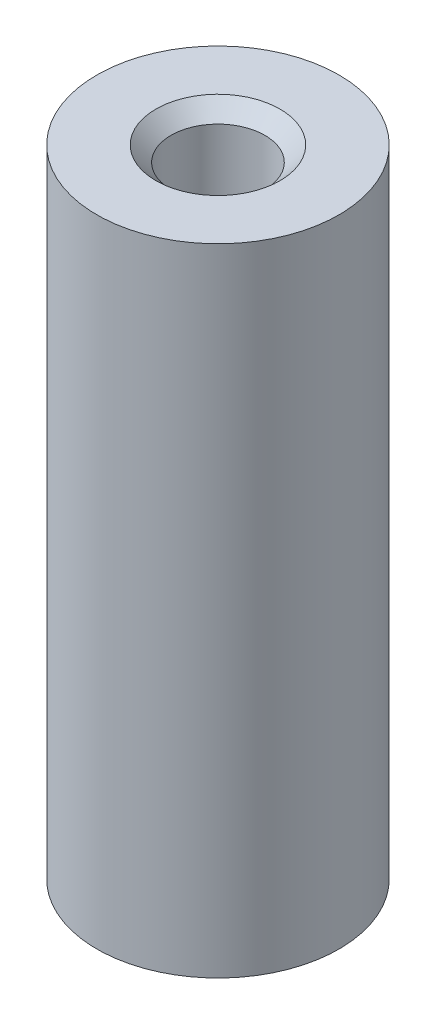
ISO-10303-21;
HEADER;
FILE_DESCRIPTION(('STEP AP214'),'2;1');
FILE_NAME('part.step','',(''),(''),'','','');
FILE_SCHEMA(('AUTOMOTIVE_DESIGN { 1 0 10303 214 1 1 1 1 }'));
ENDSEC;
DATA;
#1=APPLICATION_CONTEXT('core data for automotive mechanical design processes');
#2=APPLICATION_PROTOCOL_DEFINITION('international standard','automotive_design',2000,#1);
#3=PRODUCT_CONTEXT('',#1,'mechanical');
#4=PRODUCT('Part','Part','',(#3));
#5=PRODUCT_RELATED_PRODUCT_CATEGORY('part','',(#4));
#6=PRODUCT_DEFINITION_FORMATION('','',#4);
#7=PRODUCT_DEFINITION_CONTEXT('part definition',#1,'design');
#8=PRODUCT_DEFINITION('design','',#6,#7);
#9=PRODUCT_DEFINITION_SHAPE('','',#8);
#10=(LENGTH_UNIT() NAMED_UNIT(*) SI_UNIT(.MILLI.,.METRE.));
#11=(NAMED_UNIT(*) PLANE_ANGLE_UNIT() SI_UNIT($,.RADIAN.));
#12=(NAMED_UNIT(*) SI_UNIT($,.STERADIAN.) SOLID_ANGLE_UNIT());
#13=UNCERTAINTY_MEASURE_WITH_UNIT(LENGTH_MEASURE(1.E-05),#10,'distance_accuracy_value','');
#14=(GEOMETRIC_REPRESENTATION_CONTEXT(3) GLOBAL_UNCERTAINTY_ASSIGNED_CONTEXT((#13)) GLOBAL_UNIT_ASSIGNED_CONTEXT((#10,
#11,#12)) REPRESENTATION_CONTEXT('',''));
#15=CARTESIAN_POINT('',(0.,0.,0.));
#16=DIRECTION('',(0.,0.,1.));
#17=DIRECTION('',(1.,0.,0.));
#18=AXIS2_PLACEMENT_3D('',#15,#16,#17);
#19=CARTESIAN_POINT('',(0.,21.,0.));
#20=DIRECTION('',(0.,-1.,0.));
#21=DIRECTION('',(0.,0.,-1.));
#22=AXIS2_PLACEMENT_3D('',#19,#20,#21);
#23=CYLINDRICAL_SURFACE('',#22,4.);
#24=CARTESIAN_POINT('',(0.,21.,0.));
#25=DIRECTION('',(0.,1.,0.));
#26=DIRECTION('',(0.,0.,1.));
#27=AXIS2_PLACEMENT_3D('',#24,#25,#26);
#28=CIRCLE('',#27,4.);
#29=CARTESIAN_POINT('',(0.,21.,-4.));
#30=VERTEX_POINT('',#29);
#31=EDGE_CURVE('E62',#30,#30,#28,.T.);
#32=CARTESIAN_POINT('',(0.,0.,0.));
#33=DIRECTION('',(0.,1.,0.));
#34=DIRECTION('',(0.,0.,1.));
#35=AXIS2_PLACEMENT_3D('',#32,#33,#34);
#36=CIRCLE('',#35,4.);
#37=CARTESIAN_POINT('',(0.,0.,-4.));
#38=VERTEX_POINT('',#37);
#39=EDGE_CURVE('E63',#38,#38,#36,.T.);
#40=CARTESIAN_POINT('',(0.,21.,-4.));
#41=CARTESIAN_POINT('',(0.,20.78125,-4.));
#42=CARTESIAN_POINT('',(0.,20.5625,-4.));
#43=CARTESIAN_POINT('',(0.,20.125,-4.));
#44=CARTESIAN_POINT('',(0.,19.90625,-4.));
#45=CARTESIAN_POINT('',(0.,19.46875,-4.));
#46=CARTESIAN_POINT('',(0.,19.25,-4.));
#47=CARTESIAN_POINT('',(0.,18.8125,-4.));
#48=CARTESIAN_POINT('',(0.,18.59375,-4.));
#49=CARTESIAN_POINT('',(0.,18.15625,-4.));
#50=CARTESIAN_POINT('',(0.,17.9375,-4.));
#51=CARTESIAN_POINT('',(0.,17.5,-4.));
#52=CARTESIAN_POINT('',(0.,17.28125,-4.));
#53=CARTESIAN_POINT('',(0.,16.84375,-4.));
#54=CARTESIAN_POINT('',(0.,16.625,-4.));
#55=CARTESIAN_POINT('',(0.,16.1875,-4.));
#56=CARTESIAN_POINT('',(0.,15.96875,-4.));
#57=CARTESIAN_POINT('',(0.,15.53125,-4.));
#58=CARTESIAN_POINT('',(0.,15.3125,-4.));
#59=CARTESIAN_POINT('',(0.,14.875,-4.));
#60=CARTESIAN_POINT('',(0.,14.65625,-4.));
#61=CARTESIAN_POINT('',(0.,14.21875,-4.));
#62=CARTESIAN_POINT('',(0.,14.,-4.));
#63=CARTESIAN_POINT('',(0.,13.5625,-4.));
#64=CARTESIAN_POINT('',(0.,13.34375,-4.));
#65=CARTESIAN_POINT('',(0.,12.90625,-4.));
#66=CARTESIAN_POINT('',(0.,12.6875,-4.));
#67=CARTESIAN_POINT('',(0.,12.25,-4.));
#68=CARTESIAN_POINT('',(0.,12.03125,-4.));
#69=CARTESIAN_POINT('',(0.,11.59375,-4.));
#70=CARTESIAN_POINT('',(0.,11.375,-4.));
#71=CARTESIAN_POINT('',(0.,10.9375,-4.));
#72=CARTESIAN_POINT('',(0.,10.71875,-4.));
#73=CARTESIAN_POINT('',(0.,10.28125,-4.));
#74=CARTESIAN_POINT('',(0.,10.0625,-4.));
#75=CARTESIAN_POINT('',(0.,9.625,-4.));
#76=CARTESIAN_POINT('',(0.,9.40625,-4.));
#77=CARTESIAN_POINT('',(0.,8.96875,-4.));
#78=CARTESIAN_POINT('',(0.,8.75,-4.));
#79=CARTESIAN_POINT('',(0.,8.3125,-4.));
#80=CARTESIAN_POINT('',(0.,8.09375,-4.));
#81=CARTESIAN_POINT('',(0.,7.65625,-4.));
#82=CARTESIAN_POINT('',(0.,7.4375,-4.));
#83=CARTESIAN_POINT('',(0.,7.,-4.));
#84=CARTESIAN_POINT('',(0.,6.78125,-4.));
#85=CARTESIAN_POINT('',(0.,6.34375,-4.));
#86=CARTESIAN_POINT('',(0.,6.125,-4.));
#87=CARTESIAN_POINT('',(0.,5.6875,-4.));
#88=CARTESIAN_POINT('',(0.,5.46875,-4.));
#89=CARTESIAN_POINT('',(0.,5.03125,-4.));
#90=CARTESIAN_POINT('',(0.,4.8125,-4.));
#91=CARTESIAN_POINT('',(0.,4.375,-4.));
#92=CARTESIAN_POINT('',(0.,4.15625,-4.));
#93=CARTESIAN_POINT('',(0.,3.71875,-4.));
#94=CARTESIAN_POINT('',(0.,3.5,-4.));
#95=CARTESIAN_POINT('',(0.,3.0625,-4.));
#96=CARTESIAN_POINT('',(0.,2.84375,-4.));
#97=CARTESIAN_POINT('',(0.,2.40625,-4.));
#98=CARTESIAN_POINT('',(0.,2.1875,-4.));
#99=CARTESIAN_POINT('',(0.,1.75,-4.));
#100=CARTESIAN_POINT('',(0.,1.53125,-4.));
#101=CARTESIAN_POINT('',(0.,1.09375,-4.));
#102=CARTESIAN_POINT('',(0.,0.875000000000001,-4.));
#103=CARTESIAN_POINT('',(0.,0.4375,-4.));
#104=CARTESIAN_POINT('',(0.,0.21875,-4.));
#105=CARTESIAN_POINT('',(0.,0.,-4.));
#106=B_SPLINE_CURVE_WITH_KNOTS('',3,(#40,#41,#42,#43,#44,#45,#46,#47,#48,#49,#50,#51,#52,#53,
#54,#55,#56,#57,#58,#59,#60,#61,#62,#63,#64,#65,#66,#67,#68,#69,#70,#71,#72,#73,#74,#75,#76,#77,
#78,#79,#80,#81,#82,#83,#84,#85,#86,#87,#88,#89,#90,#91,#92,#93,#94,#95,#96,#97,#98,#99,#100,
#101,#102,#103,#104,#105),.UNSPECIFIED.,.F.,.F.,(4,2,2,2,2,2,2,2,2,2,2,2,2,2,2,2,2,2,2,2,2,2,2,
2,2,2,2,2,2,2,2,2,4),(0.,0.656249999999997,1.3125,1.96875,2.625,3.28125,3.9375,4.59375,5.25,
5.90625,6.5625,7.21875,7.875,8.53125,9.1875,9.84375,10.5,11.15625,11.8125,12.46875,13.125,
13.78125,14.4375,15.09375,15.75,16.40625,17.0625,17.71875,18.375,19.03125,19.6875,20.34375,21.),.UNSPECIFIED.);
#107=EDGE_CURVE('BSEAM41',#30,#38,#106,.T.);
#108=ORIENTED_EDGE('',*,*,#31,.F.);
#109=ORIENTED_EDGE('',*,*,#39,.T.);
#110=ORIENTED_EDGE('',*,*,#107,.T.);
#111=ORIENTED_EDGE('',*,*,#107,.F.);
#112=EDGE_LOOP('',(#108,#110,#109,#111));
#113=FACE_BOUND('',#112,.T.);
#114=ADVANCED_FACE('F41',(#113),#23,.T.);
#115=CARTESIAN_POINT('',(0.,21.,0.));
#116=DIRECTION('',(0.,1.,0.));
#117=DIRECTION('',(0.,0.,1.));
#118=AXIS2_PLACEMENT_3D('',#115,#116,#117);
#119=PLANE('',#118);
#120=CARTESIAN_POINT('',(0.,21.,0.));
#121=DIRECTION('',(0.,1.,0.));
#122=DIRECTION('',(0.,0.,1.));
#123=AXIS2_PLACEMENT_3D('',#120,#121,#122);
#124=CIRCLE('',#123,2.05000000000001);
#125=CARTESIAN_POINT('',(0.,21.,2.05000000000001));
#126=VERTEX_POINT('',#125);
#127=EDGE_CURVE('E10',#126,#126,#124,.F.);
#128=ORIENTED_EDGE('',*,*,#127,.T.);
#129=EDGE_LOOP('',(#128));
#130=FACE_BOUND('',#129,.T.);
#131=ORIENTED_EDGE('',*,*,#31,.T.);
#132=EDGE_LOOP('',(#131));
#133=FACE_BOUND('',#132,.T.);
#134=ADVANCED_FACE('F69',(#130,#133),#119,.T.);
#135=CARTESIAN_POINT('',(0.,0.,0.));
#136=DIRECTION('',(0.,1.,0.));
#137=DIRECTION('',(0.,0.,1.));
#138=AXIS2_PLACEMENT_3D('',#135,#136,#137);
#139=PLANE('',#138);
#140=CARTESIAN_POINT('',(0.,0.,0.));
#141=DIRECTION('',(0.,1.,0.));
#142=DIRECTION('',(0.,0.,1.));
#143=AXIS2_PLACEMENT_3D('',#140,#141,#142);
#144=CIRCLE('',#143,2.05);
#145=CARTESIAN_POINT('',(0.,0.,2.05));
#146=VERTEX_POINT('',#145);
#147=EDGE_CURVE('E57',#146,#146,#144,.T.);
#148=ORIENTED_EDGE('',*,*,#147,.T.);
#149=EDGE_LOOP('',(#148));
#150=FACE_BOUND('',#149,.T.);
#151=ORIENTED_EDGE('',*,*,#39,.F.);
#152=EDGE_LOOP('',(#151));
#153=FACE_BOUND('',#152,.T.);
#154=ADVANCED_FACE('F76',(#150,#153),#139,.F.);
#155=CARTESIAN_POINT('',(0.,21.,0.));
#156=DIRECTION('',(0.,1.,0.));
#157=DIRECTION('',(0.,0.,1.));
#158=AXIS2_PLACEMENT_3D('',#155,#156,#157);
#159=CYLINDRICAL_SURFACE('',#158,1.55);
#160=CARTESIAN_POINT('',(0.,0.500000000000004,0.));
#161=DIRECTION('',(0.,1.,0.));
#162=DIRECTION('',(0.,0.,1.));
#163=AXIS2_PLACEMENT_3D('',#160,#161,#162);
#164=CIRCLE('',#163,1.55);
#165=CARTESIAN_POINT('',(0.,0.500000000000004,1.55));
#166=VERTEX_POINT('',#165);
#167=EDGE_CURVE('E49',#166,#166,#164,.F.);
#168=ORIENTED_EDGE('',*,*,#167,.T.);
#169=EDGE_LOOP('',(#168));
#170=FACE_BOUND('',#169,.T.);
#171=CARTESIAN_POINT('',(0.,20.5,0.));
#172=DIRECTION('',(0.,1.,0.));
#173=DIRECTION('',(0.,0.,1.));
#174=AXIS2_PLACEMENT_3D('',#171,#172,#173);
#175=CIRCLE('',#174,1.55);
#176=CARTESIAN_POINT('',(0.,20.5,1.55));
#177=VERTEX_POINT('',#176);
#178=EDGE_CURVE('E53',#177,#177,#175,.T.);
#179=ORIENTED_EDGE('',*,*,#178,.T.);
#180=EDGE_LOOP('',(#179));
#181=FACE_BOUND('',#180,.T.);
#182=ADVANCED_FACE('F78',(#170,#181),#159,.F.);
#183=CARTESIAN_POINT('',(0.,0.,0.));
#184=DIRECTION('',(0.,-1.,0.));
#185=DIRECTION('',(0.,0.,-1.));
#186=AXIS2_PLACEMENT_3D('',#183,#184,#185);
#187=CONICAL_SURFACE('',#186,2.05,0.785398163397446);
#188=ORIENTED_EDGE('',*,*,#167,.F.);
#189=EDGE_LOOP('',(#188));
#190=FACE_BOUND('',#189,.T.);
#191=ORIENTED_EDGE('',*,*,#147,.F.);
#192=EDGE_LOOP('',(#191));
#193=FACE_BOUND('',#192,.T.);
#194=ADVANCED_FACE('F85',(#190,#193),#187,.F.);
#195=CARTESIAN_POINT('',(0.,20.5,0.));
#196=DIRECTION('',(0.,1.,0.));
#197=DIRECTION('',(0.,0.,1.));
#198=AXIS2_PLACEMENT_3D('',#195,#196,#197);
#199=CONICAL_SURFACE('',#198,1.55,0.785398163397457);
#200=ORIENTED_EDGE('',*,*,#127,.F.);
#201=EDGE_LOOP('',(#200));
#202=FACE_BOUND('',#201,.T.);
#203=ORIENTED_EDGE('',*,*,#178,.F.);
#204=EDGE_LOOP('',(#203));
#205=FACE_BOUND('',#204,.T.);
#206=ADVANCED_FACE('F44',(#202,#205),#199,.F.);
#207=CLOSED_SHELL('',(#114,#134,#154,#182,#194,#206));
#208=MANIFOLD_SOLID_BREP('B2',#207);
#209=ADVANCED_BREP_SHAPE_REPRESENTATION('',(#18,#208),#14);
#210=SHAPE_DEFINITION_REPRESENTATION(#9,#209);
ENDSEC;
END-ISO-10303-21;
